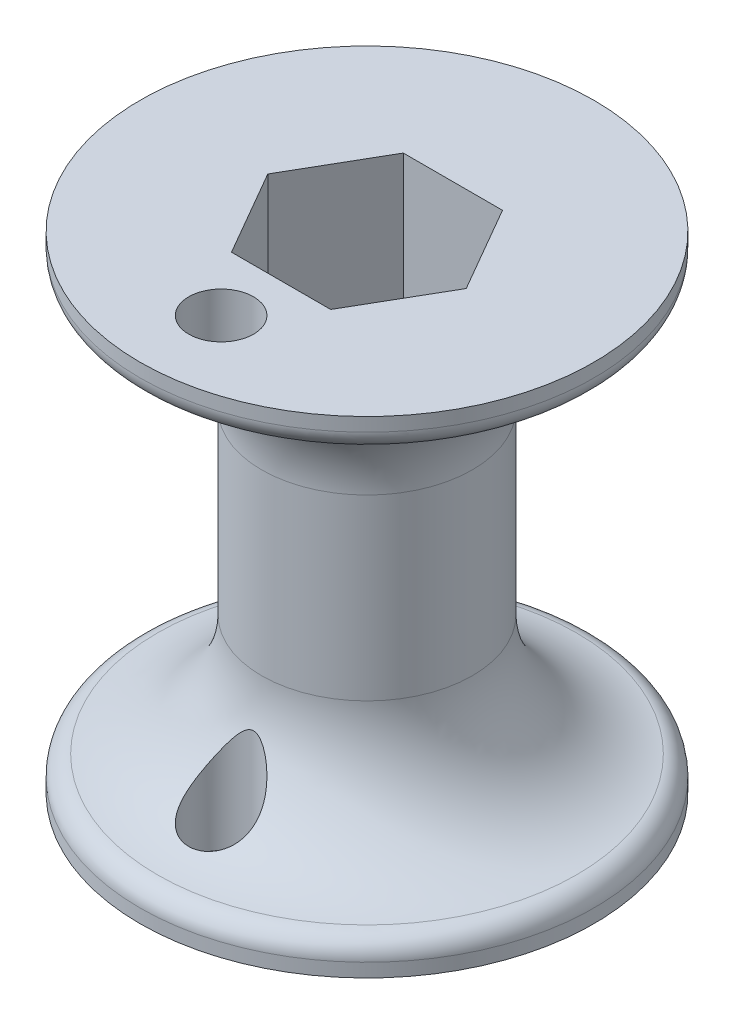
ISO-10303-21;
HEADER;
FILE_DESCRIPTION(('STEP AP214'),'2;1');
FILE_NAME('part.step','',(''),(''),'','','');
FILE_SCHEMA(('AUTOMOTIVE_DESIGN { 1 0 10303 214 1 1 1 1 }'));
ENDSEC;
DATA;
#1=APPLICATION_CONTEXT('core data for automotive mechanical design processes');
#2=APPLICATION_PROTOCOL_DEFINITION('international standard','automotive_design',2000,#1);
#3=PRODUCT_CONTEXT('',#1,'mechanical');
#4=PRODUCT('Part','Part','',(#3));
#5=PRODUCT_RELATED_PRODUCT_CATEGORY('part','',(#4));
#6=PRODUCT_DEFINITION_FORMATION('','',#4);
#7=PRODUCT_DEFINITION_CONTEXT('part definition',#1,'design');
#8=PRODUCT_DEFINITION('design','',#6,#7);
#9=PRODUCT_DEFINITION_SHAPE('','',#8);
#10=(LENGTH_UNIT() NAMED_UNIT(*) SI_UNIT(.MILLI.,.METRE.));
#11=(NAMED_UNIT(*) PLANE_ANGLE_UNIT() SI_UNIT($,.RADIAN.));
#12=(NAMED_UNIT(*) SI_UNIT($,.STERADIAN.) SOLID_ANGLE_UNIT());
#13=UNCERTAINTY_MEASURE_WITH_UNIT(LENGTH_MEASURE(1.E-05),#10,'distance_accuracy_value','');
#14=(GEOMETRIC_REPRESENTATION_CONTEXT(3) GLOBAL_UNCERTAINTY_ASSIGNED_CONTEXT((#13)) GLOBAL_UNIT_ASSIGNED_CONTEXT((#10,
#11,#12)) REPRESENTATION_CONTEXT('',''));
#15=CARTESIAN_POINT('',(0.,0.,0.));
#16=DIRECTION('',(0.,0.,1.));
#17=DIRECTION('',(1.,0.,0.));
#18=AXIS2_PLACEMENT_3D('',#15,#16,#17);
#19=CARTESIAN_POINT('',(0.,19.05,0.));
#20=DIRECTION('',(0.,1.,0.));
#21=DIRECTION('',(0.,0.,1.));
#22=AXIS2_PLACEMENT_3D('',#19,#20,#21);
#23=PLANE('',#22);
#24=DIRECTION('',(0.5,0.,0.866025403784439));
#25=VECTOR('',#24,1.);
#26=CARTESIAN_POINT('',(-7.77228932383074,19.05,0.));
#27=LINE('',#26,#25);
#28=CARTESIAN_POINT('',(-7.77228932383074,19.05,0.));
#29=VERTEX_POINT('',#28);
#30=CARTESIAN_POINT('',(-3.88614466191537,19.05,6.731));
#31=VERTEX_POINT('',#30);
#32=EDGE_CURVE('E51',#29,#31,#27,.T.);
#33=ORIENTED_EDGE('',*,*,#32,.F.);
#34=DIRECTION('',(-0.5,0.,0.866025403784439));
#35=VECTOR('',#34,1.);
#36=CARTESIAN_POINT('',(-3.88614466191537,19.05,-6.731));
#37=LINE('',#36,#35);
#38=CARTESIAN_POINT('',(-3.88614466191537,19.05,-6.731));
#39=VERTEX_POINT('',#38);
#40=EDGE_CURVE('E108',#39,#29,#37,.T.);
#41=ORIENTED_EDGE('',*,*,#40,.F.);
#42=DIRECTION('',(-1.,0.,0.));
#43=VECTOR('',#42,1.);
#44=CARTESIAN_POINT('',(3.88614466191537,19.05,-6.731));
#45=LINE('',#44,#43);
#46=CARTESIAN_POINT('',(3.88614466191537,19.05,-6.731));
#47=VERTEX_POINT('',#46);
#48=EDGE_CURVE('E111',#47,#39,#45,.T.);
#49=ORIENTED_EDGE('',*,*,#48,.F.);
#50=DIRECTION('',(-0.5,0.,-0.866025403784439));
#51=VECTOR('',#50,1.);
#52=CARTESIAN_POINT('',(7.77228932383074,19.05,0.));
#53=LINE('',#52,#51);
#54=CARTESIAN_POINT('',(7.77228932383074,19.05,0.));
#55=VERTEX_POINT('',#54);
#56=EDGE_CURVE('E128',#55,#47,#53,.T.);
#57=ORIENTED_EDGE('',*,*,#56,.F.);
#58=DIRECTION('',(0.5,0.,-0.866025403784439));
#59=VECTOR('',#58,1.);
#60=CARTESIAN_POINT('',(3.88614466191537,19.05,6.731));
#61=LINE('',#60,#59);
#62=CARTESIAN_POINT('',(3.88614466191537,19.05,6.731));
#63=VERTEX_POINT('',#62);
#64=EDGE_CURVE('E125',#63,#55,#61,.T.);
#65=ORIENTED_EDGE('',*,*,#64,.F.);
#66=DIRECTION('',(1.,0.,0.));
#67=VECTOR('',#66,1.);
#68=CARTESIAN_POINT('',(-3.88614466191537,19.05,6.731));
#69=LINE('',#68,#67);
#70=EDGE_CURVE('E122',#31,#63,#69,.T.);
#71=ORIENTED_EDGE('',*,*,#70,.F.);
#72=EDGE_LOOP('',(#33,#41,#49,#57,#65,#71));
#73=FACE_BOUND('',#72,.T.);
#74=CARTESIAN_POINT('',(0.,19.05,11.43));
#75=DIRECTION('',(0.,1.,0.));
#76=DIRECTION('',(0.,0.,1.));
#77=AXIS2_PLACEMENT_3D('',#74,#75,#76);
#78=CIRCLE('',#77,2.54);
#79=CARTESIAN_POINT('',(0.,19.05,13.97));
#80=VERTEX_POINT('',#79);
#81=EDGE_CURVE('E145',#80,#80,#78,.T.);
#82=ORIENTED_EDGE('',*,*,#81,.F.);
#83=EDGE_LOOP('',(#82));
#84=FACE_BOUND('',#83,.T.);
#85=CARTESIAN_POINT('',(0.,19.05,0.));
#86=DIRECTION('',(0.,-1.,0.));
#87=DIRECTION('',(0.,0.,-1.));
#88=AXIS2_PLACEMENT_3D('',#85,#86,#87);
#89=CIRCLE('',#88,17.78);
#90=CARTESIAN_POINT('',(0.,19.05,-17.78));
#91=VERTEX_POINT('',#90);
#92=EDGE_CURVE('E181',#91,#91,#89,.T.);
#93=ORIENTED_EDGE('',*,*,#92,.F.);
#94=EDGE_LOOP('',(#93));
#95=FACE_BOUND('',#94,.T.);
#96=ADVANCED_FACE('F36',(#73,#84,#95),#23,.T.);
#97=CARTESIAN_POINT('',(0.,0.,0.));
#98=DIRECTION('',(0.,-1.,0.));
#99=DIRECTION('',(0.,0.,-1.));
#100=AXIS2_PLACEMENT_3D('',#97,#98,#99);
#101=CYLINDRICAL_SURFACE('',#100,17.78);
#102=CARTESIAN_POINT('',(0.,17.9835226280624,0.));
#103=DIRECTION('',(0.,1.,0.));
#104=DIRECTION('',(0.,0.,1.));
#105=AXIS2_PLACEMENT_3D('',#102,#103,#104);
#106=CIRCLE('',#105,17.78);
#107=CARTESIAN_POINT('',(0.,17.9835226280624,17.78));
#108=VERTEX_POINT('',#107);
#109=EDGE_CURVE('E186',#108,#108,#106,.T.);
#110=ORIENTED_EDGE('',*,*,#109,.T.);
#111=EDGE_LOOP('',(#110));
#112=FACE_BOUND('',#111,.T.);
#113=ORIENTED_EDGE('',*,*,#92,.T.);
#114=EDGE_LOOP('',(#113));
#115=FACE_BOUND('',#114,.T.);
#116=ADVANCED_FACE('F203',(#112,#115),#101,.T.);
#117=CARTESIAN_POINT('',(0.,6.985,0.));
#118=DIRECTION('',(0.,-1.,0.));
#119=DIRECTION('',(0.,0.,-1.));
#120=AXIS2_PLACEMENT_3D('',#117,#118,#119);
#121=TOROIDAL_SURFACE('',#120,17.78,9.525);
#122=CARTESIAN_POINT('',(0.,16.4123051097678,0.));
#123=DIRECTION('',(0.,-1.,0.));
#124=DIRECTION('',(0.,0.,-1.));
#125=AXIS2_PLACEMENT_3D('',#122,#123,#124);
#126=CIRCLE('',#125,16.4192857142857);
#127=CARTESIAN_POINT('',(0.,16.4123051097678,-16.4192857142857));
#128=VERTEX_POINT('',#127);
#129=EDGE_CURVE('E183',#128,#128,#126,.T.);
#130=ORIENTED_EDGE('',*,*,#129,.T.);
#131=EDGE_LOOP('',(#130));
#132=FACE_BOUND('',#131,.T.);
#133=CARTESIAN_POINT('',(0.938255944372738,10.9468428022588,9.06964498796278));
#134=CARTESIAN_POINT('',(0.98648197386459,10.9993891656621,9.08881718518221));
#135=CARTESIAN_POINT('',(1.03293594870109,11.0531799979511,9.1089835461747));
#136=CARTESIAN_POINT('',(1.12295653989787,11.1624339405218,9.15117650190641));
#137=CARTESIAN_POINT('',(1.16652221813368,11.2178975857083,9.17320369581584));
#138=CARTESIAN_POINT('',(1.29372124824501,11.3860715821617,9.24202780511586));
#139=CARTESIAN_POINT('',(1.37373473967196,11.5004259676744,9.29151728894735));
#140=CARTESIAN_POINT('',(1.52658752264498,11.7313729083978,9.39780762601399));
#141=CARTESIAN_POINT('',(1.59938975762012,11.8479736824445,9.45464310116275));
#142=CARTESIAN_POINT('',(1.73817371171044,12.0813199422391,9.5755957953097));
#143=CARTESIAN_POINT('',(1.80416052445091,12.1980652529505,9.63970749996448));
#144=CARTESIAN_POINT('',(1.93344018661997,12.4380628937335,9.7798311109431));
#145=CARTESIAN_POINT('',(1.99629963174134,12.5612604735369,9.85633888738841));
#146=CARTESIAN_POINT('',(2.11396818458067,12.8056741312596,10.018347312183));
#147=CARTESIAN_POINT('',(2.1687742832208,12.9268894535638,10.1038513015323));
#148=CARTESIAN_POINT('',(2.2689671781953,13.1657606770975,10.283730654368));
#149=CARTESIAN_POINT('',(2.31439333679799,13.2834296067177,10.3780664266909));
#150=CARTESIAN_POINT('',(2.39445664205463,13.514570222408,10.5758559577611));
#151=CARTESIAN_POINT('',(2.42910074636548,13.628044573398,10.679303780969));
#152=CARTESIAN_POINT('',(2.49361981008058,13.8814777404827,10.9260160478918));
#153=CARTESIAN_POINT('',(2.51931149181303,14.0197519230332,11.072217774241));
#154=CARTESIAN_POINT('',(2.53785185934796,14.2183617012143,11.3006120383479));
#155=CARTESIAN_POINT('',(2.54069869676933,14.2831016368337,11.3782636324147));
#156=CARTESIAN_POINT('',(2.53901053993073,14.4093260173046,11.5360877326839));
#157=CARTESIAN_POINT('',(2.53447663998595,14.470810943369,11.6162598634472));
#158=CARTESIAN_POINT('',(2.51152815957898,14.6302801966138,11.8329981644384));
#159=CARTESIAN_POINT('',(2.48583624421988,14.7250445440662,11.97127674799));
#160=CARTESIAN_POINT('',(2.4088022967438,14.9027533290444,12.2484708837026));
#161=CARTESIAN_POINT('',(2.35746969216559,14.9857020965134,12.3873861831698));
#162=CARTESIAN_POINT('',(2.25991547092745,15.1005180622401,12.5919728498872));
#163=CARTESIAN_POINT('',(2.22377934117297,15.1373205140663,12.659809241449));
#164=CARTESIAN_POINT('',(2.14461180364819,15.207499799289,12.7931733686335));
#165=CARTESIAN_POINT('',(2.10158372504657,15.2408782739379,12.8587022003778));
#166=CARTESIAN_POINT('',(2.00872921154579,15.3041453163779,12.9865494747253));
#167=CARTESIAN_POINT('',(1.95890346720244,15.3340342380914,13.0488682425451));
#168=CARTESIAN_POINT('',(1.85274237070489,15.3902965019346,13.169368795436));
#169=CARTESIAN_POINT('',(1.7964079560287,15.4166703491835,13.2275511743477));
#170=CARTESIAN_POINT('',(1.63304761430291,15.4843786794384,13.380634572773));
#171=CARTESIAN_POINT('',(1.51962322614982,15.5221478389496,13.4704486711445));
#172=CARTESIAN_POINT('',(1.27710572605296,15.5872609818067,13.6303893535879));
#173=CARTESIAN_POINT('',(1.14801956084778,15.614609565045,13.7005246207557));
#174=CARTESIAN_POINT('',(0.887647189367185,15.6578108524812,13.8137814660195));
#175=CARTESIAN_POINT('',(0.757141396904233,15.6743319418715,13.8584451395875));
#176=CARTESIAN_POINT('',(0.489888071661992,15.6990946997047,13.9261175320453));
#177=CARTESIAN_POINT('',(0.353141715067382,15.7073379216288,13.9491303140385));
#178=CARTESIAN_POINT('',(0.0807350941650147,15.7156378523107,13.9723083349841));
#179=CARTESIAN_POINT('',(-0.0548751683114414,15.7158824017738,13.9729978102005));
#180=CARTESIAN_POINT('',(-0.324272535279986,15.7086659575796,13.9528335153767));
#181=CARTESIAN_POINT('',(-0.458059732080265,15.701205355541,13.9319808402284));
#182=CARTESIAN_POINT('',(-0.719466477405885,15.6784624798788,13.8696618337165));
#183=CARTESIAN_POINT('',(-0.847108788626245,15.6632119725474,13.8282792404444));
#184=CARTESIAN_POINT('',(-1.09326772301469,15.6246230753659,13.7265412026699));
#185=CARTESIAN_POINT('',(-1.21178455887951,15.6012848740937,13.6661862005434));
#186=CARTESIAN_POINT('',(-1.43764156768632,15.5459310512433,13.528204495514));
#187=CARTESIAN_POINT('',(-1.54486596024635,15.5138357719323,13.4504204735902));
#188=CARTESIAN_POINT('',(-1.74427546813948,15.4407968002914,13.2810067393493));
#189=CARTESIAN_POINT('',(-1.83645962012152,15.3998525415605,13.1893761408606));
#190=CARTESIAN_POINT('',(-2.00669854938505,15.3075728425176,12.9927544482935));
#191=CARTESIAN_POINT('',(-2.0842132227616,15.2559493149411,12.8874320686317));
#192=CARTESIAN_POINT('',(-2.22050283989202,15.1433573431582,12.6699406590302));
#193=CARTESIAN_POINT('',(-2.27927461103711,15.082387319455,12.5577704737879));
#194=CARTESIAN_POINT('',(-2.38194263493878,14.9467094403837,12.3220166035733));
#195=CARTESIAN_POINT('',(-2.42440143777551,14.8713159208362,12.1982058656283));
#196=CARTESIAN_POINT('',(-2.48920299193426,14.7112052302795,11.9513256526042));
#197=CARTESIAN_POINT('',(-2.51153214197953,14.6264817985126,11.8282567344507));
#198=CARTESIAN_POINT('',(-2.53422992556242,14.4749455875414,11.6216084308134));
#199=CARTESIAN_POINT('',(-2.53910945286757,14.4101348911709,11.5369997971081));
#200=CARTESIAN_POINT('',(-2.5406677287736,14.2768732645128,11.3705794512123));
#201=CARTESIAN_POINT('',(-2.53734379301469,14.2084211498413,11.2887686634214));
#202=CARTESIAN_POINT('',(-2.52332927276274,14.0682814073055,11.1285258683467));
#203=CARTESIAN_POINT('',(-2.51263228329695,13.9965910169893,11.0500968618089));
#204=CARTESIAN_POINT('',(-2.48468152313865,13.8504341807573,10.8970752673812));
#205=CARTESIAN_POINT('',(-2.46742592401821,13.7759669659364,10.8224837559088));
#206=CARTESIAN_POINT('',(-2.41935761741458,13.5955658631296,10.6495008953069));
#207=CARTESIAN_POINT('',(-2.385883304841,13.4885395294626,10.5529825436459));
#208=CARTESIAN_POINT('',(-2.30951913665167,13.2708878185504,10.3680497097391));
#209=CARTESIAN_POINT('',(-2.26662491694156,13.160260793463,10.2796390106421));
#210=CARTESIAN_POINT('',(-2.17259119734106,12.9359060085107,10.1105916825756));
#211=CARTESIAN_POINT('',(-2.1214214820307,12.8221682055992,10.0299853419274));
#212=CARTESIAN_POINT('',(-2.01191869392282,12.5928829066949,9.87672852305479));
#213=CARTESIAN_POINT('',(-1.95358774139335,12.4773359551445,9.80407570198049));
#214=CARTESIAN_POINT('',(-1.82781617589822,12.2406752237983,9.6636686565056));
#215=CARTESIAN_POINT('',(-1.76010634351532,12.1195221531205,9.5962222271143));
#216=CARTESIAN_POINT('',(-1.61738872536189,11.8772342570431,9.46918595195657));
#217=CARTESIAN_POINT('',(-1.5423745186639,11.7560995431763,9.40960312906112));
#218=CARTESIAN_POINT('',(-1.38461451868572,11.5161225432614,9.29839313392434));
#219=CARTESIAN_POINT('',(-1.30190888722211,11.3972718710405,9.24672799557538));
#220=CARTESIAN_POINT('',(-1.17017435660104,11.2225570569793,9.17505716120569));
#221=CARTESIAN_POINT('',(-1.12501874397312,11.1649524890786,9.15215241909972));
#222=CARTESIAN_POINT('',(-1.03159957926287,11.0515424307415,9.1083478890744));
#223=CARTESIAN_POINT('',(-0.983337209206691,10.9957362680526,9.08744734606609));
#224=CARTESIAN_POINT('',(-0.878234651334406,10.8817189036341,9.04592834740142));
#225=CARTESIAN_POINT('',(-0.821014721358978,10.8237767490311,9.02552213536663));
#226=CARTESIAN_POINT('',(-0.700569194388918,10.7132895400049,8.9877075605683));
#227=CARTESIAN_POINT('',(-0.637348857973944,10.6607398406066,8.97029660883838));
#228=CARTESIAN_POINT('',(-0.523720149499388,10.5798064818619,8.94412229409721));
#229=CARTESIAN_POINT('',(-0.475334235837972,10.5489557574093,8.93434487245793));
#230=CARTESIAN_POINT('',(-0.374353984228997,10.4941741365296,8.91721924427248));
#231=CARTESIAN_POINT('',(-0.321768629540005,10.4702289489177,8.90986601621138));
#232=CARTESIAN_POINT('',(-0.226449282670576,10.4371161466034,8.89978252792737));
#233=CARTESIAN_POINT('',(-0.184570289473301,10.4257454981625,8.89635434054197));
#234=CARTESIAN_POINT('',(-0.0994266651287486,10.4099022919425,8.89159028199959));
#235=CARTESIAN_POINT('',(-0.0561643216314051,10.4054188916183,8.8902511220502));
#236=CARTESIAN_POINT('',(0.0306228017927442,10.4039550292238,8.88981308701965));
#237=CARTESIAN_POINT('',(0.0741479758728633,10.4069951217351,8.89072034928665));
#238=CARTESIAN_POINT('',(0.160020643902572,10.4201830144601,8.89467965883587));
#239=CARTESIAN_POINT('',(0.202366381044456,10.4303408836902,8.89773474451259));
#240=CARTESIAN_POINT('',(0.300065670327463,10.4613494450624,8.90714966425019));
#241=CARTESIAN_POINT('',(0.354515884858702,10.4847515020847,8.91430929694718));
#242=CARTESIAN_POINT('',(0.459013584755747,10.5391505721534,8.93125455250674));
#243=CARTESIAN_POINT('',(0.509048403513955,10.5701685281646,8.94104742370111));
#244=CARTESIAN_POINT('',(0.627962383504861,10.653093177559,8.96777463900659));
#245=CARTESIAN_POINT('',(0.694497250062547,10.7079217248633,8.98589119485083));
#246=CARTESIAN_POINT('',(0.820947455037704,10.8235233105703,9.02541544141145));
#247=CARTESIAN_POINT('',(0.880856845709012,10.8843015993195,9.04682604865979));
#248=CARTESIAN_POINT('',(0.938255944372738,10.9468428022588,9.06964498796278));
#249=B_SPLINE_CURVE_WITH_KNOTS('',3,(#133,#134,#135,#136,#137,#138,#139,#140,#141,#142,#143,
#144,#145,#146,#147,#148,#149,#150,#151,#152,#153,#154,#155,#156,#157,#158,#159,#160,#161,#162,
#163,#164,#165,#166,#167,#168,#169,#170,#171,#172,#173,#174,#175,#176,#177,#178,#179,#180,#181,
#182,#183,#184,#185,#186,#187,#188,#189,#190,#191,#192,#193,#194,#195,#196,#197,#198,#199,#200,
#201,#202,#203,#204,#205,#206,#207,#208,#209,#210,#211,#212,#213,#214,#215,#216,#217,#218,#219,
#220,#221,#222,#223,#224,#225,#226,#227,#228,#229,#230,#231,#232,#233,#234,#235,#236,#237,#238,
#239,#240,#241,#242,#243,#244,#245,#246,#247,#248),.UNSPECIFIED.,.T.,.F.,(4,2,2,2,2,2,2,2,2,2,2,
2,2,2,2,2,2,2,2,2,2,2,2,2,2,2,2,2,2,2,2,2,2,2,2,2,2,2,2,2,2,2,2,2,2,2,2,2,2,2,2,2,2,2,2,2,2,4),
(0.,0.221517383084626,0.443106366489075,0.886856696209984,1.3327803914744,1.77836836889862,
2.25210048859392,2.72600916740584,3.19788678400284,3.6694592636853,4.27562413819683,
4.57874266927655,4.88181626216328,5.38843679674548,5.89487119464244,6.15020375020867,
6.40541333682605,6.6605970166949,6.9157439868311,7.36173678658482,7.80753248570105,
8.22225713537852,8.63690394043928,9.04180601577053,9.44668751273899,9.84993097844123,
10.2531650424908,10.6601969537583,11.0672549258338,11.4872078265917,11.9072317750419,
12.3586012680996,12.8102755160389,13.1299445722952,13.44971824541,13.7697700566415,
14.0899111583531,14.5331122349105,14.9765190743287,15.4215830276641,15.866515524754,
16.3290623084323,16.7920194300585,17.2526820499186,17.4826826094267,17.7125961721382,
17.9641788735041,18.2155430135919,18.3897646801819,18.5636231598001,18.6936884999463,
18.8235488685589,18.9537644140517,19.084164539151,19.2622311146202,19.4407929500719,
19.704210551788,19.9678627384054),.UNSPECIFIED.);
#250=CARTESIAN_POINT('',(0.938255944372738,10.9468428022588,9.06964498796278));
#251=VERTEX_POINT('',#250);
#252=EDGE_CURVE('E148',#251,#251,#249,.T.);
#253=ORIENTED_EDGE('',*,*,#252,.F.);
#254=EDGE_LOOP('',(#253));
#255=FACE_BOUND('',#254,.T.);
#256=CARTESIAN_POINT('',(0.,6.985,0.));
#257=DIRECTION('',(0.,-1.,0.));
#258=DIRECTION('',(0.,0.,-1.));
#259=AXIS2_PLACEMENT_3D('',#256,#257,#258);
#260=CIRCLE('',#259,8.255);
#261=CARTESIAN_POINT('',(0.,6.985,-8.255));
#262=VERTEX_POINT('',#261);
#263=EDGE_CURVE('E217',#262,#262,#260,.T.);
#264=ORIENTED_EDGE('',*,*,#263,.F.);
#265=EDGE_LOOP('',(#264));
#266=FACE_BOUND('',#265,.T.);
#267=ADVANCED_FACE('F158',(#132,#255,#266),#121,.F.);
#268=CARTESIAN_POINT('',(0.,0.,0.));
#269=DIRECTION('',(0.,-1.,0.));
#270=DIRECTION('',(0.,0.,-1.));
#271=AXIS2_PLACEMENT_3D('',#268,#269,#270);
#272=CYLINDRICAL_SURFACE('',#271,8.255);
#273=ORIENTED_EDGE('',*,*,#263,.T.);
#274=EDGE_LOOP('',(#273));
#275=FACE_BOUND('',#274,.T.);
#276=CARTESIAN_POINT('',(0.,-6.985,0.));
#277=DIRECTION('',(0.,-1.,0.));
#278=DIRECTION('',(0.,0.,-1.));
#279=AXIS2_PLACEMENT_3D('',#276,#277,#278);
#280=CIRCLE('',#279,8.255);
#281=CARTESIAN_POINT('',(0.,-6.985,-8.255));
#282=VERTEX_POINT('',#281);
#283=EDGE_CURVE('E156',#282,#282,#280,.T.);
#284=ORIENTED_EDGE('',*,*,#283,.F.);
#285=EDGE_LOOP('',(#284));
#286=FACE_BOUND('',#285,.T.);
#287=ADVANCED_FACE('F229',(#275,#286),#272,.T.);
#288=CARTESIAN_POINT('',(0.,-19.05,0.));
#289=DIRECTION('',(0.,-1.,0.));
#290=DIRECTION('',(0.,0.,1.));
#291=AXIS2_PLACEMENT_3D('',#288,#289,#290);
#292=PLANE('',#291);
#293=DIRECTION('',(0.5,0.,0.866025403784439));
#294=VECTOR('',#293,1.);
#295=CARTESIAN_POINT('',(-7.77228932383074,-19.05,0.));
#296=LINE('',#295,#294);
#297=CARTESIAN_POINT('',(-7.77228932383074,-19.05,0.));
#298=VERTEX_POINT('',#297);
#299=CARTESIAN_POINT('',(-3.88614466191537,-19.05,6.731));
#300=VERTEX_POINT('',#299);
#301=EDGE_CURVE('E91',#298,#300,#296,.T.);
#302=ORIENTED_EDGE('',*,*,#301,.T.);
#303=DIRECTION('',(1.,0.,0.));
#304=VECTOR('',#303,1.);
#305=CARTESIAN_POINT('',(-3.88614466191537,-19.05,6.731));
#306=LINE('',#305,#304);
#307=CARTESIAN_POINT('',(3.88614466191537,-19.05,6.731));
#308=VERTEX_POINT('',#307);
#309=EDGE_CURVE('E100',#300,#308,#306,.T.);
#310=ORIENTED_EDGE('',*,*,#309,.T.);
#311=DIRECTION('',(0.5,0.,-0.866025403784439));
#312=VECTOR('',#311,1.);
#313=CARTESIAN_POINT('',(3.88614466191537,-19.05,6.731));
#314=LINE('',#313,#312);
#315=CARTESIAN_POINT('',(7.77228932383074,-19.05,0.));
#316=VERTEX_POINT('',#315);
#317=EDGE_CURVE('E59',#308,#316,#314,.T.);
#318=ORIENTED_EDGE('',*,*,#317,.T.);
#319=DIRECTION('',(-0.5,0.,-0.866025403784439));
#320=VECTOR('',#319,1.);
#321=CARTESIAN_POINT('',(7.77228932383074,-19.05,0.));
#322=LINE('',#321,#320);
#323=CARTESIAN_POINT('',(3.88614466191537,-19.05,-6.731));
#324=VERTEX_POINT('',#323);
#325=EDGE_CURVE('E115',#316,#324,#322,.T.);
#326=ORIENTED_EDGE('',*,*,#325,.T.);
#327=DIRECTION('',(-1.,0.,0.));
#328=VECTOR('',#327,1.);
#329=CARTESIAN_POINT('',(3.88614466191537,-19.05,-6.731));
#330=LINE('',#329,#328);
#331=CARTESIAN_POINT('',(-3.88614466191537,-19.05,-6.731));
#332=VERTEX_POINT('',#331);
#333=EDGE_CURVE('E118',#324,#332,#330,.T.);
#334=ORIENTED_EDGE('',*,*,#333,.T.);
#335=DIRECTION('',(-0.5,0.,0.866025403784439));
#336=VECTOR('',#335,1.);
#337=CARTESIAN_POINT('',(-3.88614466191537,-19.05,-6.731));
#338=LINE('',#337,#336);
#339=EDGE_CURVE('E97',#332,#298,#338,.T.);
#340=ORIENTED_EDGE('',*,*,#339,.T.);
#341=EDGE_LOOP('',(#302,#310,#318,#326,#334,#340));
#342=FACE_BOUND('',#341,.T.);
#343=CARTESIAN_POINT('',(0.,-19.05,11.43));
#344=DIRECTION('',(0.,1.,0.));
#345=DIRECTION('',(0.,0.,1.));
#346=AXIS2_PLACEMENT_3D('',#343,#344,#345);
#347=CIRCLE('',#346,2.54);
#348=CARTESIAN_POINT('',(0.,-19.05,13.97));
#349=VERTEX_POINT('',#348);
#350=EDGE_CURVE('E123',#349,#349,#347,.T.);
#351=ORIENTED_EDGE('',*,*,#350,.T.);
#352=EDGE_LOOP('',(#351));
#353=FACE_BOUND('',#352,.T.);
#354=CARTESIAN_POINT('',(0.,-19.05,0.));
#355=DIRECTION('',(0.,-1.,0.));
#356=DIRECTION('',(0.,0.,-1.));
#357=AXIS2_PLACEMENT_3D('',#354,#355,#356);
#358=CIRCLE('',#357,17.78);
#359=CARTESIAN_POINT('',(0.,-19.05,-17.78));
#360=VERTEX_POINT('',#359);
#361=EDGE_CURVE('E219',#360,#360,#358,.T.);
#362=ORIENTED_EDGE('',*,*,#361,.T.);
#363=EDGE_LOOP('',(#362));
#364=FACE_BOUND('',#363,.T.);
#365=ADVANCED_FACE('F104',(#342,#353,#364),#292,.T.);
#366=CARTESIAN_POINT('',(0.,0.,0.));
#367=DIRECTION('',(0.,1.,0.));
#368=DIRECTION('',(0.,0.,-1.));
#369=AXIS2_PLACEMENT_3D('',#366,#367,#368);
#370=CYLINDRICAL_SURFACE('',#369,17.78);
#371=CARTESIAN_POINT('',(0.,-17.9835226280624,0.));
#372=DIRECTION('',(0.,1.,0.));
#373=DIRECTION('',(0.,0.,1.));
#374=AXIS2_PLACEMENT_3D('',#371,#372,#373);
#375=CIRCLE('',#374,17.78);
#376=CARTESIAN_POINT('',(0.,-17.9835226280624,17.78));
#377=VERTEX_POINT('',#376);
#378=EDGE_CURVE('E44',#377,#377,#375,.F.);
#379=ORIENTED_EDGE('',*,*,#378,.T.);
#380=EDGE_LOOP('',(#379));
#381=FACE_BOUND('',#380,.T.);
#382=ORIENTED_EDGE('',*,*,#361,.F.);
#383=EDGE_LOOP('',(#382));
#384=FACE_BOUND('',#383,.T.);
#385=ADVANCED_FACE('F191',(#381,#384),#370,.T.);
#386=CARTESIAN_POINT('',(0.,-6.985,0.));
#387=DIRECTION('',(0.,1.,0.));
#388=DIRECTION('',(0.,0.,-1.));
#389=AXIS2_PLACEMENT_3D('',#386,#387,#388);
#390=TOROIDAL_SURFACE('',#389,17.78,9.525);
#391=CARTESIAN_POINT('',(0.,-16.4123051097678,0.));
#392=DIRECTION('',(0.,1.,0.));
#393=DIRECTION('',(0.,0.,1.));
#394=AXIS2_PLACEMENT_3D('',#391,#392,#393);
#395=CIRCLE('',#394,16.4192857142857);
#396=CARTESIAN_POINT('',(0.,-16.4123051097678,16.4192857142857));
#397=VERTEX_POINT('',#396);
#398=EDGE_CURVE('E11',#397,#397,#395,.T.);
#399=ORIENTED_EDGE('',*,*,#398,.T.);
#400=EDGE_LOOP('',(#399));
#401=FACE_BOUND('',#400,.T.);
#402=CARTESIAN_POINT('',(-2.53039785874364,-14.1389652817267,11.2093494245065));
#403=CARTESIAN_POINT('',(-2.53750140477387,-14.2101950604827,11.290814840558));
#404=CARTESIAN_POINT('',(-2.54079652044688,-14.2797722308636,11.3740541085285));
#405=CARTESIAN_POINT('',(-2.53887821461035,-14.4151614285752,11.543431457334));
#406=CARTESIAN_POINT('',(-2.53366779189586,-14.4809747744495,11.6295685060136));
#407=CARTESIAN_POINT('',(-2.51387904740487,-14.6082828249792,11.8037298010089));
#408=CARTESIAN_POINT('',(-2.49931743681987,-14.669785016918,11.8917504105628));
#409=CARTESIAN_POINT('',(-2.46007732449569,-14.7881240673234,12.0686148010566));
#410=CARTESIAN_POINT('',(-2.435403034778,-14.8449628563239,12.1574582242473));
#411=CARTESIAN_POINT('',(-2.36273170118434,-14.9762993938219,12.371613802167));
#412=CARTESIAN_POINT('',(-2.30930040657998,-15.0482853949308,12.4966947775638));
#413=CARTESIAN_POINT('',(-2.17994190014904,-15.1812594337289,12.7409308272891));
#414=CARTESIAN_POINT('',(-2.1040229233647,-15.2422514842997,12.8600880522868));
#415=CARTESIAN_POINT('',(-1.92982468819972,-15.3531119683486,13.0877062589533));
#416=CARTESIAN_POINT('',(-1.83145097913421,-15.4029316006921,13.1961192026991));
#417=CARTESIAN_POINT('',(-1.6146252177196,-15.4911213034204,13.3963007698607));
#418=CARTESIAN_POINT('',(-1.49617694975141,-15.5294935280711,13.4880725236743));
#419=CARTESIAN_POINT('',(-1.25275768017139,-15.5925667686941,13.6439170511465));
#420=CARTESIAN_POINT('',(-1.12903204026919,-15.618105554827,13.7096004805797));
#421=CARTESIAN_POINT('',(-0.871155799280168,-15.6601646841645,13.8200513923252));
#422=CARTESIAN_POINT('',(-0.737007962886284,-15.6766874097887,13.8648243995929));
#423=CARTESIAN_POINT('',(-0.467862019034585,-15.7005734353246,13.930225623996));
#424=CARTESIAN_POINT('',(-0.333108425974787,-15.7082738653363,13.9517406218648));
#425=CARTESIAN_POINT('',(-0.0616818574246897,-15.7158467711707,13.9728956566235));
#426=CARTESIAN_POINT('',(0.0749909194042431,-15.7157200513234,13.9725379411873));
#427=CARTESIAN_POINT('',(0.34472306599159,-15.7076830416953,13.9500940343276));
#428=CARTESIAN_POINT('',(0.477805884902435,-15.6998617906835,13.9282564024739));
#429=CARTESIAN_POINT('',(0.738198329925612,-15.6763997864989,13.8640588499862));
#430=CARTESIAN_POINT('',(0.865508139987525,-15.6607592826679,13.8216995837512));
#431=CARTESIAN_POINT('',(1.11117632484475,-15.6213148188242,13.7179498321864));
#432=CARTESIAN_POINT('',(1.22950905178468,-15.59748847016,13.6565071976958));
#433=CARTESIAN_POINT('',(1.45371302232603,-15.5413529965985,13.5170434628477));
#434=CARTESIAN_POINT('',(1.55958414466175,-15.5090437891632,13.439022201182));
#435=CARTESIAN_POINT('',(1.75826862825209,-15.434973216178,13.2678283410768));
#436=CARTESIAN_POINT('',(1.85079299326096,-15.3930426352097,13.1743941251022));
#437=CARTESIAN_POINT('',(2.01855270872458,-15.3000084159259,12.9771957404308));
#438=CARTESIAN_POINT('',(2.09378602857569,-15.2489037014842,12.8734303605248));
#439=CARTESIAN_POINT('',(2.22956794824682,-15.1348540201745,12.653975049144));
#440=CARTESIAN_POINT('',(2.28917017621653,-15.0714375998046,12.5379467538956));
#441=CARTESIAN_POINT('',(2.38866397809836,-14.9352209395376,12.303029685028));
#442=CARTESIAN_POINT('',(2.42854799388202,-14.8624171148434,12.184139832837));
#443=CARTESIAN_POINT('',(2.49309890467152,-14.6999733205978,11.9344173815827));
#444=CARTESIAN_POINT('',(2.51566328927576,-14.6093645225628,11.8036781608664));
#445=CARTESIAN_POINT('',(2.54058165709049,-14.4190862329219,11.5470224365768));
#446=CARTESIAN_POINT('',(2.54292829736272,-14.3194134626276,11.4211077017499));
#447=CARTESIAN_POINT('',(2.53180850355552,-14.1372788696004,11.2058789999191));
#448=CARTESIAN_POINT('',(2.52198280947657,-14.0563876394387,11.115002544823));
#449=CARTESIAN_POINT('',(2.49353101689649,-13.8908360545734,10.9381386940107));
#450=CARTESIAN_POINT('',(2.47490119741053,-13.8061741199314,10.8521533827241));
#451=CARTESIAN_POINT('',(2.42991711757028,-13.6334757537871,10.6852894828175));
#452=CARTESIAN_POINT('',(2.4035411379512,-13.545430447353,10.6044260409651));
#453=CARTESIAN_POINT('',(2.34407856241734,-13.3667270410797,10.4482258512645));
#454=CARTESIAN_POINT('',(2.31099000199778,-13.2760681830369,10.3728907301448));
#455=CARTESIAN_POINT('',(2.22434192607568,-13.0555016959852,10.1983875252055));
#456=CARTESIAN_POINT('',(2.16791942987888,-12.9245708204364,10.1019263132629));
#457=CARTESIAN_POINT('',(2.0451603580075,-12.6598795493975,9.91970113943402));
#458=CARTESIAN_POINT('',(1.97881755230639,-12.5261174215031,9.83394396230074));
#459=CARTESIAN_POINT('',(1.83729285306667,-12.2574663785593,9.67289314033837));
#460=CARTESIAN_POINT('',(1.76212976086819,-12.122580409784,9.59757795936559));
#461=CARTESIAN_POINT('',(1.60290736350278,-11.8530588715443,9.45677819051204));
#462=CARTESIAN_POINT('',(1.51885446153345,-11.7184231919762,9.39128660796222));
#463=CARTESIAN_POINT('',(1.3729839924709,-11.5003642599235,9.29196371874606));
#464=CARTESIAN_POINT('',(1.31423776398769,-11.4161724241852,9.25529710826907));
#465=CARTESIAN_POINT('',(1.19165162434471,-11.2497295534747,9.18577560146373));
#466=CARTESIAN_POINT('',(1.12780441328056,-11.1674815263606,9.15292633912279));
#467=CARTESIAN_POINT('',(0.98691463969887,-10.9985157162229,9.08815312014549));
#468=CARTESIAN_POINT('',(0.909190745502755,-10.9121819285694,9.05665548962072));
#469=CARTESIAN_POINT('',(0.784431653356651,-10.7896621014599,9.01376896407691));
#470=CARTESIAN_POINT('',(0.741543494079827,-10.7500321567165,9.00021475796003));
#471=CARTESIAN_POINT('',(0.652418099238904,-10.6741825665264,8.97478052598522));
#472=CARTESIAN_POINT('',(0.606185012053913,-10.6379588207745,8.96289847843281));
#473=CARTESIAN_POINT('',(0.516691929962025,-10.5754552396181,8.94274988327139));
#474=CARTESIAN_POINT('',(0.473976905527123,-10.5484953624785,8.93420884473585));
#475=CARTESIAN_POINT('',(0.385266777947127,-10.4998475188765,8.91898575672089));
#476=CARTESIAN_POINT('',(0.33927251556003,-10.4781582073453,8.91230323287819));
#477=CARTESIAN_POINT('',(0.243364904624107,-10.4418812329859,8.9012193885082));
#478=CARTESIAN_POINT('',(0.193402088321737,-10.4274081471628,8.89685480503458));
#479=CARTESIAN_POINT('',(0.0914791067013575,-10.4084045286775,8.89113939742753));
#480=CARTESIAN_POINT('',(0.0395244653148267,-10.4038482734885,8.88978077620118));
#481=CARTESIAN_POINT('',(-0.0569131157314104,-10.4053945005058,8.89024413909647));
#482=CARTESIAN_POINT('',(-0.101426577609637,-10.4100977800012,8.89164857699562));
#483=CARTESIAN_POINT('',(-0.188958602391398,-10.4267529151931,8.89665777454725));
#484=CARTESIAN_POINT('',(-0.231974899798847,-10.4387152906051,8.90026572753233));
#485=CARTESIAN_POINT('',(-0.332716674208924,-10.4745502767064,8.91118788229338));
#486=CARTESIAN_POINT('',(-0.389301392026862,-10.5012889888937,8.91941294125181));
#487=CARTESIAN_POINT('',(-0.497619595724569,-10.5624624825007,8.9386103220002));
#488=CARTESIAN_POINT('',(-0.549337928125786,-10.596920242859,8.94959085859003));
#489=CARTESIAN_POINT('',(-0.661821074988184,-10.6806656542844,8.97688276777356));
#490=CARTESIAN_POINT('',(-0.721292133363513,-10.7314521202012,8.99383403119328));
#491=CARTESIAN_POINT('',(-0.835006246543762,-10.8377605556418,9.03043072569766));
#492=CARTESIAN_POINT('',(-0.889238888874749,-10.8932915594077,9.05008134197053));
#493=CARTESIAN_POINT('',(-0.993829569375513,-11.007547004656,9.0918201831528));
#494=CARTESIAN_POINT('',(-1.04416635951715,-11.0662863339412,9.11392036762214));
#495=CARTESIAN_POINT('',(-1.1415044416808,-11.185655829266,9.16031435695178));
#496=CARTESIAN_POINT('',(-1.18850418530602,-11.2462868545168,9.18460916839652));
#497=CARTESIAN_POINT('',(-1.28341424692672,-11.3737198745904,9.23736906068577));
#498=CARTESIAN_POINT('',(-1.33108860425077,-11.4406231800188,9.26601258133561));
#499=CARTESIAN_POINT('',(-1.42363611582175,-11.5752765383194,9.32574519047153));
#500=CARTESIAN_POINT('',(-1.46850873681845,-11.6430267494546,9.35683474197749));
#501=CARTESIAN_POINT('',(-1.59945758124145,-11.8470509459915,9.45384783700588));
#502=CARTESIAN_POINT('',(-1.6817916984651,-11.9839976366769,9.52347463521852));
#503=CARTESIAN_POINT('',(-1.83720236459977,-12.2571593108175,9.67277305972197));
#504=CARTESIAN_POINT('',(-1.91029848756902,-12.393375235219,9.75242270866903));
#505=CARTESIAN_POINT('',(-2.04708939832392,-12.6638609335402,9.92238010379363));
#506=CARTESIAN_POINT('',(-2.11078706562349,-12.7981312921284,10.0126845702073));
#507=CARTESIAN_POINT('',(-2.21633271745837,-13.0378641804587,10.1859428634237));
#508=CARTESIAN_POINT('',(-2.26002720319187,-13.1439038396893,10.266973949807));
#509=CARTESIAN_POINT('',(-2.33946409891499,-13.3531150291253,10.4363898354676));
#510=CARTESIAN_POINT('',(-2.37520564550484,-13.4562862468593,10.5247754317472));
#511=CARTESIAN_POINT('',(-2.43734427818382,-13.658780342888,10.7086443336775));
#512=CARTESIAN_POINT('',(-2.46375628185768,-13.758109136491,10.8041160103867));
#513=CARTESIAN_POINT('',(-2.5056930983608,-13.9521981858274,11.0018570117412));
#514=CARTESIAN_POINT('',(-2.52122246362903,-14.0469603364173,11.1041234743589));
#515=CARTESIAN_POINT('',(-2.53039785874364,-14.1389652817267,11.2093494245065));
#516=B_SPLINE_CURVE_WITH_KNOTS('',3,(#402,#403,#404,#405,#406,#407,#408,#409,#410,#411,#412,
#413,#414,#415,#416,#417,#418,#419,#420,#421,#422,#423,#424,#425,#426,#427,#428,#429,#430,#431,
#432,#433,#434,#435,#436,#437,#438,#439,#440,#441,#442,#443,#444,#445,#446,#447,#448,#449,#450,
#451,#452,#453,#454,#455,#456,#457,#458,#459,#460,#461,#462,#463,#464,#465,#466,#467,#468,#469,
#470,#471,#472,#473,#474,#475,#476,#477,#478,#479,#480,#481,#482,#483,#484,#485,#486,#487,#488,
#489,#490,#491,#492,#493,#494,#495,#496,#497,#498,#499,#500,#501,#502,#503,#504,#505,#506,#507,
#508,#509,#510,#511,#512,#513,#514,#515),.UNSPECIFIED.,.T.,.F.,(4,2,2,2,2,2,2,2,2,2,2,2,2,2,2,2,
2,2,2,2,2,2,2,2,2,2,2,2,2,2,2,2,2,2,2,2,2,2,2,2,2,2,2,2,2,2,2,2,2,2,2,2,2,2,2,2,4),(0.,
0.325225255198372,0.650335870592083,0.97486710251725,1.299263301422,1.75884425724453,
2.2182571210704,2.67963922172426,3.1409344408977,3.56595523290558,3.99086366222402,
4.39892801159403,4.80695042770971,5.210306212632,5.61364913609133,6.01810412028981,
6.42256303997301,6.83477006112886,7.24702546581849,7.68033850986642,8.11381751730575,
8.59400042390131,9.07435772210089,9.44005813718842,9.8059132506998,10.1728041328106,
10.5398025445582,11.05545878278,11.5714402276042,12.0863411287347,12.6008736481098,
12.9277427608067,13.2550883288541,13.6153993410332,13.7950930322825,13.9745675663597,
14.127949297161,14.2812918431369,14.4369972019546,14.5922982045516,14.7259185915586,
14.8597330821499,15.0480218550586,15.2368787771922,15.4763856993665,15.7163592971836,
15.9575609302644,16.1988737597616,16.4597815256047,16.7207387991996,17.2430457162653,
17.7642266887789,18.2852476479699,18.7061357956719,19.1270696142407,19.5473272960221,
19.9674090699696),.UNSPECIFIED.);
#517=CARTESIAN_POINT('',(-2.53039785874364,-14.1389652817267,11.2093494245065));
#518=VERTEX_POINT('',#517);
#519=EDGE_CURVE('E135',#518,#518,#516,.T.);
#520=ORIENTED_EDGE('',*,*,#519,.F.);
#521=EDGE_LOOP('',(#520));
#522=FACE_BOUND('',#521,.T.);
#523=ORIENTED_EDGE('',*,*,#283,.T.);
#524=EDGE_LOOP('',(#523));
#525=FACE_BOUND('',#524,.T.);
#526=ADVANCED_FACE('F167',(#401,#522,#525),#390,.F.);
#527=CARTESIAN_POINT('',(0.,-19.05,11.43));
#528=DIRECTION('',(0.,1.,0.));
#529=DIRECTION('',(0.,0.,1.));
#530=AXIS2_PLACEMENT_3D('',#527,#528,#529);
#531=CYLINDRICAL_SURFACE('',#530,2.54);
#532=ORIENTED_EDGE('',*,*,#519,.T.);
#533=EDGE_LOOP('',(#532));
#534=FACE_BOUND('',#533,.T.);
#535=ORIENTED_EDGE('',*,*,#350,.F.);
#536=EDGE_LOOP('',(#535));
#537=FACE_BOUND('',#536,.T.);
#538=ADVANCED_FACE('F162',(#534,#537),#531,.F.);
#539=CARTESIAN_POINT('',(-7.77228932383074,-19.05,0.));
#540=DIRECTION('',(-0.866025403784439,0.,0.5));
#541=DIRECTION('',(0.5,0.,0.866025403784439));
#542=AXIS2_PLACEMENT_3D('',#539,#540,#541);
#543=PLANE('',#542);
#544=ORIENTED_EDGE('',*,*,#32,.T.);
#545=DIRECTION('',(0.,1.,0.));
#546=VECTOR('',#545,1.);
#547=CARTESIAN_POINT('',(-3.88614466191537,-19.05,6.731));
#548=LINE('',#547,#546);
#549=EDGE_CURVE('E87',#300,#31,#548,.T.);
#550=ORIENTED_EDGE('',*,*,#549,.F.);
#551=ORIENTED_EDGE('',*,*,#301,.F.);
#552=DIRECTION('',(0.,1.,0.));
#553=VECTOR('',#552,1.);
#554=CARTESIAN_POINT('',(-7.77228932383074,-19.05,0.));
#555=LINE('',#554,#553);
#556=EDGE_CURVE('E133',#298,#29,#555,.T.);
#557=ORIENTED_EDGE('',*,*,#556,.T.);
#558=EDGE_LOOP('',(#544,#550,#551,#557));
#559=FACE_BOUND('',#558,.T.);
#560=ADVANCED_FACE('F89',(#559),#543,.F.);
#561=CARTESIAN_POINT('',(-3.88614466191537,-19.05,-6.731));
#562=DIRECTION('',(-0.866025403784439,0.,-0.5));
#563=DIRECTION('',(-0.5,0.,0.866025403784438));
#564=AXIS2_PLACEMENT_3D('',#561,#562,#563);
#565=PLANE('',#564);
#566=ORIENTED_EDGE('',*,*,#40,.T.);
#567=ORIENTED_EDGE('',*,*,#556,.F.);
#568=ORIENTED_EDGE('',*,*,#339,.F.);
#569=DIRECTION('',(0.,1.,0.));
#570=VECTOR('',#569,1.);
#571=CARTESIAN_POINT('',(-3.88614466191537,-19.05,-6.731));
#572=LINE('',#571,#570);
#573=EDGE_CURVE('E136',#332,#39,#572,.T.);
#574=ORIENTED_EDGE('',*,*,#573,.T.);
#575=EDGE_LOOP('',(#566,#567,#568,#574));
#576=FACE_BOUND('',#575,.T.);
#577=ADVANCED_FACE('F260',(#576),#565,.F.);
#578=CARTESIAN_POINT('',(3.88614466191537,-19.05,-6.731));
#579=DIRECTION('',(0.,0.,-1.));
#580=DIRECTION('',(-1.,0.,0.));
#581=AXIS2_PLACEMENT_3D('',#578,#579,#580);
#582=PLANE('',#581);
#583=ORIENTED_EDGE('',*,*,#48,.T.);
#584=ORIENTED_EDGE('',*,*,#573,.F.);
#585=ORIENTED_EDGE('',*,*,#333,.F.);
#586=DIRECTION('',(0.,1.,0.));
#587=VECTOR('',#586,1.);
#588=CARTESIAN_POINT('',(3.88614466191537,-19.05,-6.731));
#589=LINE('',#588,#587);
#590=EDGE_CURVE('E138',#324,#47,#589,.T.);
#591=ORIENTED_EDGE('',*,*,#590,.T.);
#592=EDGE_LOOP('',(#583,#584,#585,#591));
#593=FACE_BOUND('',#592,.T.);
#594=ADVANCED_FACE('F266',(#593),#582,.F.);
#595=CARTESIAN_POINT('',(7.77228932383074,-19.05,0.));
#596=DIRECTION('',(0.866025403784439,0.,-0.5));
#597=DIRECTION('',(-0.5,0.,-0.866025403784439));
#598=AXIS2_PLACEMENT_3D('',#595,#596,#597);
#599=PLANE('',#598);
#600=ORIENTED_EDGE('',*,*,#56,.T.);
#601=ORIENTED_EDGE('',*,*,#590,.F.);
#602=ORIENTED_EDGE('',*,*,#325,.F.);
#603=DIRECTION('',(0.,1.,0.));
#604=VECTOR('',#603,1.);
#605=CARTESIAN_POINT('',(7.77228932383074,-19.05,0.));
#606=LINE('',#605,#604);
#607=EDGE_CURVE('E140',#316,#55,#606,.T.);
#608=ORIENTED_EDGE('',*,*,#607,.T.);
#609=EDGE_LOOP('',(#600,#601,#602,#608));
#610=FACE_BOUND('',#609,.T.);
#611=ADVANCED_FACE('F274',(#610),#599,.F.);
#612=CARTESIAN_POINT('',(3.88614466191537,-19.05,6.731));
#613=DIRECTION('',(0.866025403784439,0.,0.5));
#614=DIRECTION('',(0.5,0.,-0.866025403784439));
#615=AXIS2_PLACEMENT_3D('',#612,#613,#614);
#616=PLANE('',#615);
#617=ORIENTED_EDGE('',*,*,#64,.T.);
#618=ORIENTED_EDGE('',*,*,#607,.F.);
#619=ORIENTED_EDGE('',*,*,#317,.F.);
#620=DIRECTION('',(0.,1.,0.));
#621=VECTOR('',#620,1.);
#622=CARTESIAN_POINT('',(3.88614466191537,-19.05,6.731));
#623=LINE('',#622,#621);
#624=EDGE_CURVE('E96',#308,#63,#623,.T.);
#625=ORIENTED_EDGE('',*,*,#624,.T.);
#626=EDGE_LOOP('',(#617,#618,#619,#625));
#627=FACE_BOUND('',#626,.T.);
#628=ADVANCED_FACE('F282',(#627),#616,.F.);
#629=CARTESIAN_POINT('',(-3.88614466191537,-19.05,6.731));
#630=DIRECTION('',(0.,0.,1.));
#631=DIRECTION('',(1.,0.,0.));
#632=AXIS2_PLACEMENT_3D('',#629,#630,#631);
#633=PLANE('',#632);
#634=ORIENTED_EDGE('',*,*,#70,.T.);
#635=ORIENTED_EDGE('',*,*,#624,.F.);
#636=ORIENTED_EDGE('',*,*,#309,.F.);
#637=ORIENTED_EDGE('',*,*,#549,.T.);
#638=EDGE_LOOP('',(#634,#635,#636,#637));
#639=FACE_BOUND('',#638,.T.);
#640=ADVANCED_FACE('F101',(#639),#633,.F.);
#641=ORIENTED_EDGE('',*,*,#252,.T.);
#642=EDGE_LOOP('',(#641));
#643=FACE_BOUND('',#642,.T.);
#644=ORIENTED_EDGE('',*,*,#81,.T.);
#645=EDGE_LOOP('',(#644));
#646=FACE_BOUND('',#645,.T.);
#647=ADVANCED_FACE('F169',(#643,#646),#531,.F.);
#648=CARTESIAN_POINT('',(0.,17.9835226280624,0.));
#649=DIRECTION('',(0.,1.,0.));
#650=DIRECTION('',(0.,0.,1.));
#651=AXIS2_PLACEMENT_3D('',#648,#649,#650);
#652=TOROIDAL_SURFACE('',#651,16.1925,1.5875);
#653=ORIENTED_EDGE('',*,*,#109,.F.);
#654=EDGE_LOOP('',(#653));
#655=FACE_BOUND('',#654,.T.);
#656=ORIENTED_EDGE('',*,*,#129,.F.);
#657=EDGE_LOOP('',(#656));
#658=FACE_BOUND('',#657,.T.);
#659=ADVANCED_FACE('F195',(#655,#658),#652,.T.);
#660=CARTESIAN_POINT('',(0.,-17.9835226280624,0.));
#661=DIRECTION('',(0.,1.,0.));
#662=DIRECTION('',(0.,0.,1.));
#663=AXIS2_PLACEMENT_3D('',#660,#661,#662);
#664=TOROIDAL_SURFACE('',#663,16.1925,1.5875);
#665=ORIENTED_EDGE('',*,*,#398,.F.);
#666=EDGE_LOOP('',(#665));
#667=FACE_BOUND('',#666,.T.);
#668=ORIENTED_EDGE('',*,*,#378,.F.);
#669=EDGE_LOOP('',(#668));
#670=FACE_BOUND('',#669,.T.);
#671=ADVANCED_FACE('F38',(#667,#670),#664,.T.);
#672=CLOSED_SHELL('',(#96,#116,#267,#287,#365,#385,#526,#538,#560,#577,#594,#611,#628,#640,#647,
#659,#671));
#673=MANIFOLD_SOLID_BREP('B2',#672);
#674=ADVANCED_BREP_SHAPE_REPRESENTATION('',(#18,#673),#14);
#675=SHAPE_DEFINITION_REPRESENTATION(#9,#674);
ENDSEC;
END-ISO-10303-21;
